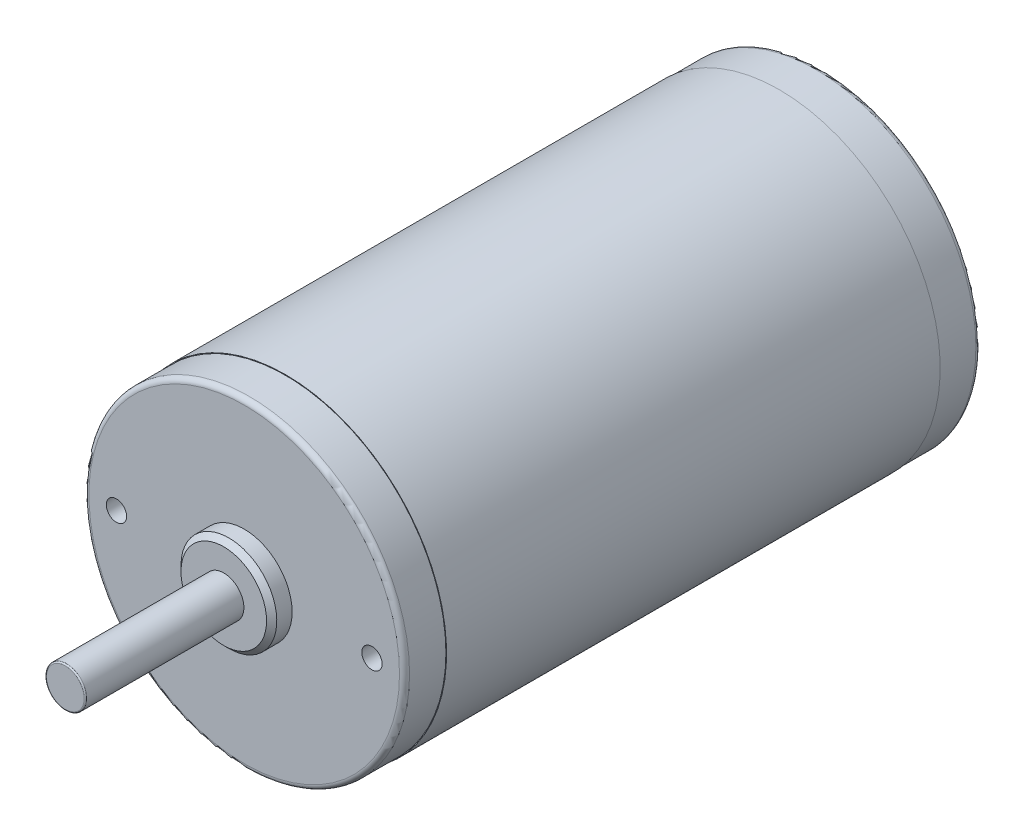
ISO-10303-21;
HEADER;
FILE_DESCRIPTION(('STEP AP214'),'2;1');
FILE_NAME('part.step','',(''),(''),'','','');
FILE_SCHEMA(('AUTOMOTIVE_DESIGN { 1 0 10303 214 1 1 1 1 }'));
ENDSEC;
DATA;
#1=APPLICATION_CONTEXT('core data for automotive mechanical design processes');
#2=APPLICATION_PROTOCOL_DEFINITION('international standard','automotive_design',2000,#1);
#3=PRODUCT_CONTEXT('',#1,'mechanical');
#4=PRODUCT('Part','Part','',(#3));
#5=PRODUCT_RELATED_PRODUCT_CATEGORY('part','',(#4));
#6=PRODUCT_DEFINITION_FORMATION('','',#4);
#7=PRODUCT_DEFINITION_CONTEXT('part definition',#1,'design');
#8=PRODUCT_DEFINITION('design','',#6,#7);
#9=PRODUCT_DEFINITION_SHAPE('','',#8);
#10=(LENGTH_UNIT() NAMED_UNIT(*) SI_UNIT(.MILLI.,.METRE.));
#11=(NAMED_UNIT(*) PLANE_ANGLE_UNIT() SI_UNIT($,.RADIAN.));
#12=(NAMED_UNIT(*) SI_UNIT($,.STERADIAN.) SOLID_ANGLE_UNIT());
#13=UNCERTAINTY_MEASURE_WITH_UNIT(LENGTH_MEASURE(1.E-05),#10,'distance_accuracy_value','');
#14=(GEOMETRIC_REPRESENTATION_CONTEXT(3) GLOBAL_UNCERTAINTY_ASSIGNED_CONTEXT((#13)) GLOBAL_UNIT_ASSIGNED_CONTEXT((#10,
#11,#12)) REPRESENTATION_CONTEXT('',''));
#15=CARTESIAN_POINT('',(0.,0.,0.));
#16=DIRECTION('',(0.,0.,1.));
#17=DIRECTION('',(1.,0.,0.));
#18=AXIS2_PLACEMENT_3D('',#15,#16,#17);
#19=CARTESIAN_POINT('',(35.56,109.2962,-99.317299999998));
#20=DIRECTION('',(0.,0.,-1.));
#21=DIRECTION('',(0.,-1.,0.));
#22=AXIS2_PLACEMENT_3D('',#19,#20,#21);
#23=TOROIDAL_SURFACE('',#22,14.0368000000003,1.);
#24=CARTESIAN_POINT('',(35.56,109.2962,-99.317299999998));
#25=DIRECTION('',(0.,0.,1.));
#26=DIRECTION('',(1.,0.,0.));
#27=AXIS2_PLACEMENT_3D('',#24,#25,#26);
#28=CIRCLE('',#27,15.0368000000003);
#29=CARTESIAN_POINT('',(50.5968000000003,109.2962,-99.317299999998));
#30=VERTEX_POINT('',#29);
#31=EDGE_CURVE('E51',#30,#30,#28,.T.);
#32=ORIENTED_EDGE('',*,*,#31,.F.);
#33=EDGE_LOOP('',(#32));
#34=FACE_BOUND('',#33,.T.);
#35=CARTESIAN_POINT('',(35.56,109.2962,-100.317299999998));
#36=DIRECTION('',(0.,0.,-1.));
#37=DIRECTION('',(0.,-1.,0.));
#38=AXIS2_PLACEMENT_3D('',#35,#36,#37);
#39=CIRCLE('',#38,14.0368000000003);
#40=CARTESIAN_POINT('',(35.56,95.2593999999997,-100.317299999998));
#41=VERTEX_POINT('',#40);
#42=EDGE_CURVE('E89',#41,#41,#39,.T.);
#43=ORIENTED_EDGE('',*,*,#42,.F.);
#44=EDGE_LOOP('',(#43));
#45=FACE_BOUND('',#44,.T.);
#46=ADVANCED_FACE('F16',(#34,#45),#23,.T.);
#47=CARTESIAN_POINT('',(35.56,109.2962,18.05));
#48=DIRECTION('',(0.,0.,1.));
#49=DIRECTION('',(1.,0.,0.));
#50=AXIS2_PLACEMENT_3D('',#47,#48,#49);
#51=TOROIDAL_SURFACE('',#50,30.8770000000005,1.);
#52=CARTESIAN_POINT('',(35.56,109.2962,18.05));
#53=DIRECTION('',(0.,0.,-1.));
#54=DIRECTION('',(0.,-1.,0.));
#55=AXIS2_PLACEMENT_3D('',#52,#53,#54);
#56=CIRCLE('',#55,31.8770000000005);
#57=CARTESIAN_POINT('',(35.56,77.4191999999995,18.05));
#58=VERTEX_POINT('',#57);
#59=EDGE_CURVE('E67',#58,#58,#56,.T.);
#60=ORIENTED_EDGE('',*,*,#59,.F.);
#61=EDGE_LOOP('',(#60));
#62=FACE_BOUND('',#61,.T.);
#63=CARTESIAN_POINT('',(35.56,109.2962,19.05));
#64=DIRECTION('',(0.,0.,1.));
#65=DIRECTION('',(1.,0.,0.));
#66=AXIS2_PLACEMENT_3D('',#63,#64,#65);
#67=CIRCLE('',#66,30.8770000000005);
#68=CARTESIAN_POINT('',(66.4370000000005,109.2962,19.05));
#69=VERTEX_POINT('',#68);
#70=EDGE_CURVE('E88',#69,#69,#67,.T.);
#71=ORIENTED_EDGE('',*,*,#70,.F.);
#72=EDGE_LOOP('',(#71));
#73=FACE_BOUND('',#72,.T.);
#74=ADVANCED_FACE('F109',(#62,#73),#51,.T.);
#75=CARTESIAN_POINT('',(35.56,109.2962,-94.554799999998));
#76=DIRECTION('',(0.,0.,-1.));
#77=DIRECTION('',(0.,-1.,0.));
#78=AXIS2_PLACEMENT_3D('',#75,#76,#77);
#79=TOROIDAL_SURFACE('',#78,30.8770000000005,1.);
#80=CARTESIAN_POINT('',(35.56,109.2962,-94.554799999998));
#81=DIRECTION('',(0.,0.,1.));
#82=DIRECTION('',(1.,0.,0.));
#83=AXIS2_PLACEMENT_3D('',#80,#81,#82);
#84=CIRCLE('',#83,31.8770000000005);
#85=CARTESIAN_POINT('',(67.4370000000005,109.2962,-94.554799999998));
#86=VERTEX_POINT('',#85);
#87=EDGE_CURVE('E56',#86,#86,#84,.T.);
#88=ORIENTED_EDGE('',*,*,#87,.F.);
#89=EDGE_LOOP('',(#88));
#90=FACE_BOUND('',#89,.T.);
#91=CARTESIAN_POINT('',(35.56,109.2962,-95.554799999998));
#92=DIRECTION('',(0.,0.,-1.));
#93=DIRECTION('',(0.,-1.,0.));
#94=AXIS2_PLACEMENT_3D('',#91,#92,#93);
#95=CIRCLE('',#94,30.8770000000005);
#96=CARTESIAN_POINT('',(35.56,78.4191999999995,-95.554799999998));
#97=VERTEX_POINT('',#96);
#98=EDGE_CURVE('E72',#97,#97,#95,.T.);
#99=ORIENTED_EDGE('',*,*,#98,.F.);
#100=EDGE_LOOP('',(#99));
#101=FACE_BOUND('',#100,.T.);
#102=ADVANCED_FACE('F266',(#90,#101),#79,.T.);
#103=CARTESIAN_POINT('',(35.56,109.2962,54.36));
#104=DIRECTION('',(0.,0.,1.));
#105=DIRECTION('',(1.,0.,0.));
#106=AXIS2_PLACEMENT_3D('',#103,#104,#105);
#107=TOROIDAL_SURFACE('',#106,3.74600000000007,0.254);
#108=CARTESIAN_POINT('',(35.56,109.2962,54.36));
#109=DIRECTION('',(0.,0.,-1.));
#110=DIRECTION('',(0.,-1.,0.));
#111=AXIS2_PLACEMENT_3D('',#108,#109,#110);
#112=CIRCLE('',#111,4.00000000000007);
#113=CARTESIAN_POINT('',(35.56,105.2962,54.36));
#114=VERTEX_POINT('',#113);
#115=EDGE_CURVE('E60',#114,#114,#112,.T.);
#116=ORIENTED_EDGE('',*,*,#115,.F.);
#117=EDGE_LOOP('',(#116));
#118=FACE_BOUND('',#117,.T.);
#119=CARTESIAN_POINT('',(35.56,109.2962,54.614));
#120=DIRECTION('',(0.,0.,1.));
#121=DIRECTION('',(1.,0.,0.));
#122=AXIS2_PLACEMENT_3D('',#119,#120,#121);
#123=CIRCLE('',#122,3.74600000000008);
#124=CARTESIAN_POINT('',(39.3060000000001,109.2962,54.614));
#125=VERTEX_POINT('',#124);
#126=EDGE_CURVE('E86',#125,#125,#123,.T.);
#127=ORIENTED_EDGE('',*,*,#126,.F.);
#128=EDGE_LOOP('',(#127));
#129=FACE_BOUND('',#128,.T.);
#130=ADVANCED_FACE('F259',(#118,#129),#107,.T.);
#131=CARTESIAN_POINT('',(35.56,109.2962,6.22299997150597));
#132=DIRECTION('',(0.,0.,-1.));
#133=DIRECTION('',(0.,-1.,0.));
#134=AXIS2_PLACEMENT_3D('',#131,#132,#133);
#135=CONICAL_SURFACE('',#134,25.4,0.785398162500006);
#136=CARTESIAN_POINT('',(35.56,109.2962,23.114));
#137=DIRECTION('',(0.,0.,1.));
#138=DIRECTION('',(1.,0.,0.));
#139=AXIS2_PLACEMENT_3D('',#136,#137,#138);
#140=CIRCLE('',#139,8.50900000182338);
#141=CARTESIAN_POINT('',(44.0690000018234,109.2962,23.114));
#142=VERTEX_POINT('',#141);
#143=EDGE_CURVE('E80',#142,#142,#140,.T.);
#144=ORIENTED_EDGE('',*,*,#143,.F.);
#145=EDGE_LOOP('',(#144));
#146=FACE_BOUND('',#145,.T.);
#147=CARTESIAN_POINT('',(35.56,109.2962,22.0979999999996));
#148=DIRECTION('',(0.,0.,-1.));
#149=DIRECTION('',(0.,-1.,0.));
#150=AXIS2_PLACEMENT_3D('',#147,#148,#149);
#151=CIRCLE('',#150,9.52500000000019);
#152=CARTESIAN_POINT('',(35.56,99.7711999999998,22.0979999999996));
#153=VERTEX_POINT('',#152);
#154=EDGE_CURVE('E47',#153,#153,#151,.T.);
#155=ORIENTED_EDGE('',*,*,#154,.F.);
#156=EDGE_LOOP('',(#155));
#157=FACE_BOUND('',#156,.T.);
#158=ADVANCED_FACE('F18',(#146,#157),#135,.T.);
#159=CARTESIAN_POINT('',(10.1599999999994,109.2962,19.05));
#160=DIRECTION('',(0.,0.,1.));
#161=DIRECTION('',(1.,0.,0.));
#162=AXIS2_PLACEMENT_3D('',#159,#160,#161);
#163=CYLINDRICAL_SURFACE('',#162,2.01930000000003);
#164=CARTESIAN_POINT('',(10.1599999999994,109.2962,5.4356000000007));
#165=DIRECTION('',(0.,0.,1.));
#166=DIRECTION('',(1.,0.,0.));
#167=AXIS2_PLACEMENT_3D('',#164,#165,#166);
#168=CIRCLE('',#167,2.01930000000003);
#169=CARTESIAN_POINT('',(12.1792999999994,109.2962,5.4356000000007));
#170=VERTEX_POINT('',#169);
#171=EDGE_CURVE('E25',#170,#170,#168,.T.);
#172=ORIENTED_EDGE('',*,*,#171,.F.);
#173=EDGE_LOOP('',(#172));
#174=FACE_BOUND('',#173,.T.);
#175=CARTESIAN_POINT('',(10.1599999999994,109.2962,19.05));
#176=DIRECTION('',(0.,0.,1.));
#177=DIRECTION('',(1.,0.,0.));
#178=AXIS2_PLACEMENT_3D('',#175,#176,#177);
#179=CIRCLE('',#178,2.01930000000003);
#180=CARTESIAN_POINT('',(12.1792999999994,109.2962,19.05));
#181=VERTEX_POINT('',#180);
#182=EDGE_CURVE('E11',#181,#181,#179,.T.);
#183=ORIENTED_EDGE('',*,*,#182,.T.);
#184=EDGE_LOOP('',(#183));
#185=FACE_BOUND('',#184,.T.);
#186=ADVANCED_FACE('F36',(#174,#185),#163,.F.);
#187=CARTESIAN_POINT('',(10.1599999999994,109.2962,19.4841419127419));
#188=DIRECTION('',(0.,0.,1.));
#189=DIRECTION('',(1.,0.,0.));
#190=AXIS2_PLACEMENT_3D('',#187,#188,#189);
#191=CONICAL_SURFACE('',#190,25.4,1.0297442575);
#192=CARTESIAN_POINT('',(10.1599999999994,109.2962,4.22228214876447));
#193=VERTEX_POINT('',#192);
#194=VERTEX_LOOP('',#193);
#195=FACE_BOUND('',#194,.T.);
#196=ORIENTED_EDGE('',*,*,#171,.T.);
#197=EDGE_LOOP('',(#196));
#198=FACE_BOUND('',#197,.T.);
#199=ADVANCED_FACE('F32',(#195,#198),#191,.F.);
#200=CARTESIAN_POINT('',(60.96,109.2962,19.05));
#201=DIRECTION('',(0.,0.,1.));
#202=DIRECTION('',(1.,0.,0.));
#203=AXIS2_PLACEMENT_3D('',#200,#201,#202);
#204=CYLINDRICAL_SURFACE('',#203,2.01930000000003);
#205=CARTESIAN_POINT('',(60.96,109.2962,5.43560000000074));
#206=DIRECTION('',(0.,0.,1.));
#207=DIRECTION('',(1.,0.,0.));
#208=AXIS2_PLACEMENT_3D('',#205,#206,#207);
#209=CIRCLE('',#208,2.01930000000003);
#210=CARTESIAN_POINT('',(62.9793,109.2962,5.43560000000074));
#211=VERTEX_POINT('',#210);
#212=EDGE_CURVE('E44',#211,#211,#209,.T.);
#213=ORIENTED_EDGE('',*,*,#212,.F.);
#214=EDGE_LOOP('',(#213));
#215=FACE_BOUND('',#214,.T.);
#216=CARTESIAN_POINT('',(60.96,109.2962,19.05));
#217=DIRECTION('',(0.,0.,1.));
#218=DIRECTION('',(1.,0.,0.));
#219=AXIS2_PLACEMENT_3D('',#216,#217,#218);
#220=CIRCLE('',#219,2.01930000000003);
#221=CARTESIAN_POINT('',(62.9793,109.2962,19.05));
#222=VERTEX_POINT('',#221);
#223=EDGE_CURVE('E41',#222,#222,#220,.T.);
#224=ORIENTED_EDGE('',*,*,#223,.T.);
#225=EDGE_LOOP('',(#224));
#226=FACE_BOUND('',#225,.T.);
#227=ADVANCED_FACE('F35',(#215,#226),#204,.F.);
#228=CARTESIAN_POINT('',(60.96,109.2962,19.4841419127419));
#229=DIRECTION('',(0.,0.,1.));
#230=DIRECTION('',(1.,0.,0.));
#231=AXIS2_PLACEMENT_3D('',#228,#229,#230);
#232=CONICAL_SURFACE('',#231,25.4,1.0297442575);
#233=CARTESIAN_POINT('',(60.96,109.2962,4.22228214876453));
#234=VERTEX_POINT('',#233);
#235=VERTEX_LOOP('',#234);
#236=FACE_BOUND('',#235,.T.);
#237=ORIENTED_EDGE('',*,*,#212,.T.);
#238=EDGE_LOOP('',(#237));
#239=FACE_BOUND('',#238,.T.);
#240=ADVANCED_FACE('F130',(#236,#239),#232,.F.);
#241=CARTESIAN_POINT('',(35.56,109.2962,-100.317299999998));
#242=DIRECTION('',(0.,0.,1.));
#243=DIRECTION('',(1.,0.,0.));
#244=AXIS2_PLACEMENT_3D('',#241,#242,#243);
#245=CYLINDRICAL_SURFACE('',#244,15.0368000000003);
#246=ORIENTED_EDGE('',*,*,#31,.T.);
#247=EDGE_LOOP('',(#246));
#248=FACE_BOUND('',#247,.T.);
#249=CARTESIAN_POINT('',(35.56,109.2962,-95.554799999998));
#250=DIRECTION('',(0.,0.,-1.));
#251=DIRECTION('',(0.,-1.,0.));
#252=AXIS2_PLACEMENT_3D('',#249,#250,#251);
#253=CIRCLE('',#252,15.0368000000003);
#254=CARTESIAN_POINT('',(35.56,94.2593999999997,-95.554799999998));
#255=VERTEX_POINT('',#254);
#256=EDGE_CURVE('E53',#255,#255,#253,.T.);
#257=ORIENTED_EDGE('',*,*,#256,.T.);
#258=EDGE_LOOP('',(#257));
#259=FACE_BOUND('',#258,.T.);
#260=ADVANCED_FACE('F104',(#248,#259),#245,.T.);
#261=CARTESIAN_POINT('',(35.56,109.2962,-95.554799999998));
#262=DIRECTION('',(0.,0.,1.));
#263=DIRECTION('',(1.,0.,0.));
#264=AXIS2_PLACEMENT_3D('',#261,#262,#263);
#265=CYLINDRICAL_SURFACE('',#264,31.8770000000005);
#266=ORIENTED_EDGE('',*,*,#87,.T.);
#267=EDGE_LOOP('',(#266));
#268=FACE_BOUND('',#267,.T.);
#269=CARTESIAN_POINT('',(35.56,109.2962,-87.325199999998));
#270=DIRECTION('',(0.,0.,-1.));
#271=DIRECTION('',(0.,-1.,0.));
#272=AXIS2_PLACEMENT_3D('',#269,#270,#271);
#273=CIRCLE('',#272,31.8770000000005);
#274=CARTESIAN_POINT('',(35.56,77.4191999999995,-87.325199999998));
#275=VERTEX_POINT('',#274);
#276=EDGE_CURVE('E57',#275,#275,#273,.T.);
#277=ORIENTED_EDGE('',*,*,#276,.T.);
#278=EDGE_LOOP('',(#277));
#279=FACE_BOUND('',#278,.T.);
#280=ADVANCED_FACE('F136',(#268,#279),#265,.T.);
#281=CARTESIAN_POINT('',(35.56,109.2962,54.614));
#282=DIRECTION('',(0.,0.,-1.));
#283=DIRECTION('',(0.,-1.,0.));
#284=AXIS2_PLACEMENT_3D('',#281,#282,#283);
#285=CYLINDRICAL_SURFACE('',#284,4.00000000000007);
#286=ORIENTED_EDGE('',*,*,#115,.T.);
#287=EDGE_LOOP('',(#286));
#288=FACE_BOUND('',#287,.T.);
#289=CARTESIAN_POINT('',(35.56,109.2962,23.114));
#290=DIRECTION('',(0.,0.,1.));
#291=DIRECTION('',(1.,0.,0.));
#292=AXIS2_PLACEMENT_3D('',#289,#290,#291);
#293=CIRCLE('',#292,4.00000000000007);
#294=CARTESIAN_POINT('',(39.5600000000001,109.2962,23.114));
#295=VERTEX_POINT('',#294);
#296=EDGE_CURVE('E61',#295,#295,#293,.T.);
#297=ORIENTED_EDGE('',*,*,#296,.T.);
#298=EDGE_LOOP('',(#297));
#299=FACE_BOUND('',#298,.T.);
#300=ADVANCED_FACE('F139',(#288,#299),#285,.T.);
#301=CARTESIAN_POINT('',(35.56,109.2962,23.114));
#302=DIRECTION('',(0.,0.,-1.));
#303=DIRECTION('',(0.,-1.,0.));
#304=AXIS2_PLACEMENT_3D('',#301,#302,#303);
#305=CYLINDRICAL_SURFACE('',#304,9.52500000000019);
#306=ORIENTED_EDGE('',*,*,#154,.T.);
#307=EDGE_LOOP('',(#306));
#308=FACE_BOUND('',#307,.T.);
#309=CARTESIAN_POINT('',(35.56,109.2962,19.05));
#310=DIRECTION('',(0.,0.,1.));
#311=DIRECTION('',(1.,0.,0.));
#312=AXIS2_PLACEMENT_3D('',#309,#310,#311);
#313=CIRCLE('',#312,9.52500000000019);
#314=CARTESIAN_POINT('',(45.0850000000002,109.2962,19.05));
#315=VERTEX_POINT('',#314);
#316=EDGE_CURVE('E64',#315,#315,#313,.T.);
#317=ORIENTED_EDGE('',*,*,#316,.T.);
#318=EDGE_LOOP('',(#317));
#319=FACE_BOUND('',#318,.T.);
#320=ADVANCED_FACE('F143',(#308,#319),#305,.T.);
#321=CARTESIAN_POINT('',(35.56,109.2962,19.05));
#322=DIRECTION('',(0.,0.,-1.));
#323=DIRECTION('',(0.,-1.,0.));
#324=AXIS2_PLACEMENT_3D('',#321,#322,#323);
#325=CYLINDRICAL_SURFACE('',#324,31.8770000000005);
#326=ORIENTED_EDGE('',*,*,#59,.T.);
#327=EDGE_LOOP('',(#326));
#328=FACE_BOUND('',#327,.T.);
#329=CARTESIAN_POINT('',(35.56,109.2962,10.8204000000007));
#330=DIRECTION('',(0.,0.,1.));
#331=DIRECTION('',(1.,0.,0.));
#332=AXIS2_PLACEMENT_3D('',#329,#330,#331);
#333=CIRCLE('',#332,31.8770000000005);
#334=CARTESIAN_POINT('',(67.4370000000005,109.2962,10.8204000000007));
#335=VERTEX_POINT('',#334);
#336=EDGE_CURVE('E68',#335,#335,#333,.T.);
#337=ORIENTED_EDGE('',*,*,#336,.T.);
#338=EDGE_LOOP('',(#337));
#339=FACE_BOUND('',#338,.T.);
#340=ADVANCED_FACE('F147',(#328,#339),#325,.T.);
#341=CARTESIAN_POINT('',(35.56,109.2962,10.8204000000007));
#342=DIRECTION('',(0.,0.,-1.));
#343=DIRECTION('',(0.,-1.,0.));
#344=AXIS2_PLACEMENT_3D('',#341,#342,#343);
#345=CYLINDRICAL_SURFACE('',#344,32.0040000000005);
#346=CARTESIAN_POINT('',(35.56,109.2962,10.8204000000007));
#347=DIRECTION('',(0.,0.,-1.));
#348=DIRECTION('',(0.,-1.,0.));
#349=AXIS2_PLACEMENT_3D('',#346,#347,#348);
#350=CIRCLE('',#349,32.0040000000005);
#351=CARTESIAN_POINT('',(35.56,77.2921999999995,10.8204000000007));
#352=VERTEX_POINT('',#351);
#353=EDGE_CURVE('E70',#352,#352,#350,.T.);
#354=ORIENTED_EDGE('',*,*,#353,.T.);
#355=EDGE_LOOP('',(#354));
#356=FACE_BOUND('',#355,.T.);
#357=CARTESIAN_POINT('',(35.56,109.2962,-87.325199999998));
#358=DIRECTION('',(0.,0.,-1.));
#359=DIRECTION('',(0.,-1.,0.));
#360=AXIS2_PLACEMENT_3D('',#357,#358,#359);
#361=CIRCLE('',#360,32.0040000000005);
#362=CARTESIAN_POINT('',(35.56,77.2921999999995,-87.325199999998));
#363=VERTEX_POINT('',#362);
#364=EDGE_CURVE('E20',#363,#363,#361,.T.);
#365=ORIENTED_EDGE('',*,*,#364,.F.);
#366=EDGE_LOOP('',(#365));
#367=FACE_BOUND('',#366,.T.);
#368=ADVANCED_FACE('F150',(#356,#367),#345,.T.);
#369=CARTESIAN_POINT('',(35.56,109.2962,-95.554799999998));
#370=DIRECTION('',(0.,0.,-1.));
#371=DIRECTION('',(-1.,0.,0.));
#372=AXIS2_PLACEMENT_3D('',#369,#370,#371);
#373=PLANE('',#372);
#374=ORIENTED_EDGE('',*,*,#98,.T.);
#375=EDGE_LOOP('',(#374));
#376=FACE_BOUND('',#375,.T.);
#377=ORIENTED_EDGE('',*,*,#256,.F.);
#378=EDGE_LOOP('',(#377));
#379=FACE_BOUND('',#378,.T.);
#380=ADVANCED_FACE('F153',(#376,#379),#373,.T.);
#381=CARTESIAN_POINT('',(35.56,109.2962,-87.325199999998));
#382=DIRECTION('',(0.,0.,-1.));
#383=DIRECTION('',(-1.,0.,0.));
#384=AXIS2_PLACEMENT_3D('',#381,#382,#383);
#385=PLANE('',#384);
#386=ORIENTED_EDGE('',*,*,#364,.T.);
#387=EDGE_LOOP('',(#386));
#388=FACE_BOUND('',#387,.T.);
#389=ORIENTED_EDGE('',*,*,#276,.F.);
#390=EDGE_LOOP('',(#389));
#391=FACE_BOUND('',#390,.T.);
#392=ADVANCED_FACE('F157',(#388,#391),#385,.T.);
#393=CARTESIAN_POINT('',(35.56,109.2962,23.114));
#394=DIRECTION('',(0.,0.,1.));
#395=DIRECTION('',(1.,0.,0.));
#396=AXIS2_PLACEMENT_3D('',#393,#394,#395);
#397=PLANE('',#396);
#398=ORIENTED_EDGE('',*,*,#143,.T.);
#399=EDGE_LOOP('',(#398));
#400=FACE_BOUND('',#399,.T.);
#401=ORIENTED_EDGE('',*,*,#296,.F.);
#402=EDGE_LOOP('',(#401));
#403=FACE_BOUND('',#402,.T.);
#404=ADVANCED_FACE('F164',(#400,#403),#397,.T.);
#405=CARTESIAN_POINT('',(67.5640000000005,109.2962,10.8204000000007));
#406=DIRECTION('',(0.,0.,1.));
#407=DIRECTION('',(1.,0.,0.));
#408=AXIS2_PLACEMENT_3D('',#405,#406,#407);
#409=PLANE('',#408);
#410=ORIENTED_EDGE('',*,*,#353,.F.);
#411=EDGE_LOOP('',(#410));
#412=FACE_BOUND('',#411,.T.);
#413=ORIENTED_EDGE('',*,*,#336,.F.);
#414=EDGE_LOOP('',(#413));
#415=FACE_BOUND('',#414,.T.);
#416=ADVANCED_FACE('F171',(#412,#415),#409,.T.);
#417=CARTESIAN_POINT('',(35.56,109.2962,19.05));
#418=DIRECTION('',(0.,0.,1.));
#419=DIRECTION('',(1.,0.,0.));
#420=AXIS2_PLACEMENT_3D('',#417,#418,#419);
#421=PLANE('',#420);
#422=ORIENTED_EDGE('',*,*,#70,.T.);
#423=EDGE_LOOP('',(#422));
#424=FACE_BOUND('',#423,.T.);
#425=ORIENTED_EDGE('',*,*,#182,.F.);
#426=EDGE_LOOP('',(#425));
#427=FACE_BOUND('',#426,.T.);
#428=ORIENTED_EDGE('',*,*,#223,.F.);
#429=EDGE_LOOP('',(#428));
#430=FACE_BOUND('',#429,.T.);
#431=ORIENTED_EDGE('',*,*,#316,.F.);
#432=EDGE_LOOP('',(#431));
#433=FACE_BOUND('',#432,.T.);
#434=ADVANCED_FACE('F121',(#424,#427,#430,#433),#421,.T.);
#435=CARTESIAN_POINT('',(35.56,109.2962,54.614));
#436=DIRECTION('',(0.,0.,1.));
#437=DIRECTION('',(1.,0.,0.));
#438=AXIS2_PLACEMENT_3D('',#435,#436,#437);
#439=PLANE('',#438);
#440=ORIENTED_EDGE('',*,*,#126,.T.);
#441=EDGE_LOOP('',(#440));
#442=FACE_BOUND('',#441,.T.);
#443=ADVANCED_FACE('F115',(#442),#439,.T.);
#444=CARTESIAN_POINT('',(35.56,109.2962,-100.317299999998));
#445=DIRECTION('',(0.,0.,-1.));
#446=DIRECTION('',(-1.,0.,0.));
#447=AXIS2_PLACEMENT_3D('',#444,#445,#446);
#448=PLANE('',#447);
#449=ORIENTED_EDGE('',*,*,#42,.T.);
#450=EDGE_LOOP('',(#449));
#451=FACE_BOUND('',#450,.T.);
#452=ADVANCED_FACE('F113',(#451),#448,.T.);
#453=CLOSED_SHELL('',(#46,#74,#102,#130,#158,#186,#199,#227,#240,#260,#280,#300,#320,#340,#368,
#380,#392,#404,#416,#434,#443,#452));
#454=MANIFOLD_SOLID_BREP('B1',#453);
#455=ADVANCED_BREP_SHAPE_REPRESENTATION('',(#18,#454),#14);
#456=SHAPE_DEFINITION_REPRESENTATION(#9,#455);
ENDSEC;
END-ISO-10303-21;
